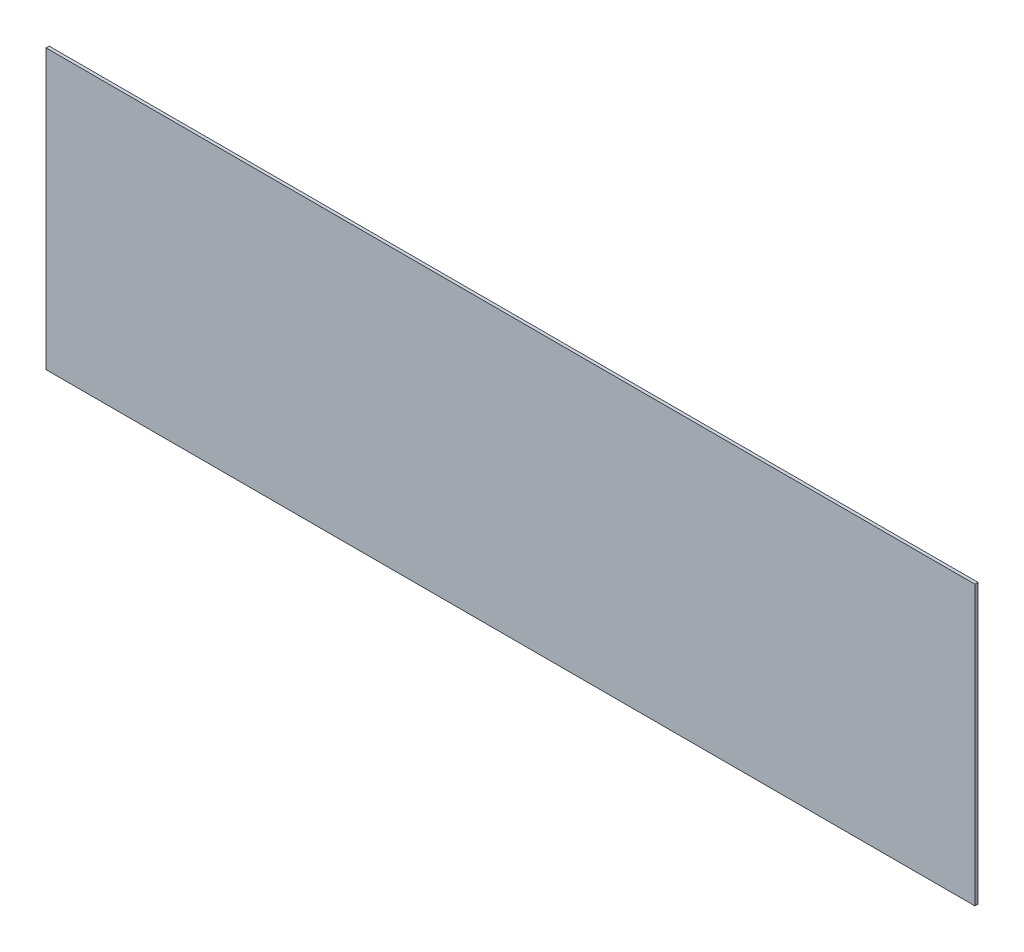
ISO-10303-21;
HEADER;
FILE_DESCRIPTION(('STEP AP214'),'2;1');
FILE_NAME('part.step','',(''),(''),'','','');
FILE_SCHEMA(('AUTOMOTIVE_DESIGN { 1 0 10303 214 1 1 1 1 }'));
ENDSEC;
DATA;
#1=APPLICATION_CONTEXT('core data for automotive mechanical design processes');
#2=APPLICATION_PROTOCOL_DEFINITION('international standard','automotive_design',2000,#1);
#3=PRODUCT_CONTEXT('',#1,'mechanical');
#4=PRODUCT('Part','Part','',(#3));
#5=PRODUCT_RELATED_PRODUCT_CATEGORY('part','',(#4));
#6=PRODUCT_DEFINITION_FORMATION('','',#4);
#7=PRODUCT_DEFINITION_CONTEXT('part definition',#1,'design');
#8=PRODUCT_DEFINITION('design','',#6,#7);
#9=PRODUCT_DEFINITION_SHAPE('','',#8);
#10=(LENGTH_UNIT() NAMED_UNIT(*) SI_UNIT(.MILLI.,.METRE.));
#11=(NAMED_UNIT(*) PLANE_ANGLE_UNIT() SI_UNIT($,.RADIAN.));
#12=(NAMED_UNIT(*) SI_UNIT($,.STERADIAN.) SOLID_ANGLE_UNIT());
#13=UNCERTAINTY_MEASURE_WITH_UNIT(LENGTH_MEASURE(1.E-05),#10,'distance_accuracy_value','');
#14=(GEOMETRIC_REPRESENTATION_CONTEXT(3) GLOBAL_UNCERTAINTY_ASSIGNED_CONTEXT((#13)) GLOBAL_UNIT_ASSIGNED_CONTEXT((#10,
#11,#12)) REPRESENTATION_CONTEXT('',''));
#15=CARTESIAN_POINT('',(0.,0.,0.));
#16=DIRECTION('',(0.,0.,1.));
#17=DIRECTION('',(1.,0.,0.));
#18=AXIS2_PLACEMENT_3D('',#15,#16,#17);
#19=CARTESIAN_POINT('',(50.,130.,-250.));
#20=DIRECTION('',(-1.,0.,0.));
#21=DIRECTION('',(0.,0.,1.));
#22=AXIS2_PLACEMENT_3D('',#19,#20,#21);
#23=PLANE('',#22);
#24=DIRECTION('',(0.,-1.,0.));
#25=VECTOR('',#24,1.);
#26=CARTESIAN_POINT('',(50.,130.,-248.));
#27=LINE('',#26,#25);
#28=CARTESIAN_POINT('',(50.,310.,-248.));
#29=VERTEX_POINT('',#28);
#30=CARTESIAN_POINT('',(50.,130.,-248.));
#31=VERTEX_POINT('',#30);
#32=EDGE_CURVE('E103',#29,#31,#27,.T.);
#33=ORIENTED_EDGE('',*,*,#32,.F.);
#34=DIRECTION('',(0.,0.,1.));
#35=VECTOR('',#34,1.);
#36=CARTESIAN_POINT('',(50.,310.,-250.));
#37=LINE('',#36,#35);
#38=CARTESIAN_POINT('',(50.,310.,-250.));
#39=VERTEX_POINT('',#38);
#40=EDGE_CURVE('E11',#39,#29,#37,.T.);
#41=ORIENTED_EDGE('',*,*,#40,.F.);
#42=DIRECTION('',(0.,-1.,0.));
#43=VECTOR('',#42,1.);
#44=CARTESIAN_POINT('',(50.,130.,-250.));
#45=LINE('',#44,#43);
#46=CARTESIAN_POINT('',(50.,130.,-250.));
#47=VERTEX_POINT('',#46);
#48=EDGE_CURVE('E97',#39,#47,#45,.T.);
#49=ORIENTED_EDGE('',*,*,#48,.T.);
#50=DIRECTION('',(0.,0.,1.));
#51=VECTOR('',#50,1.);
#52=CARTESIAN_POINT('',(50.,130.,-250.));
#53=LINE('',#52,#51);
#54=EDGE_CURVE('E42',#47,#31,#53,.T.);
#55=ORIENTED_EDGE('',*,*,#54,.T.);
#56=EDGE_LOOP('',(#33,#41,#49,#55));
#57=FACE_BOUND('',#56,.T.);
#58=ADVANCED_FACE('F39',(#57),#23,.T.);
#59=CARTESIAN_POINT('',(50.,310.,-250.));
#60=DIRECTION('',(0.,1.,0.));
#61=DIRECTION('',(0.,0.,1.));
#62=AXIS2_PLACEMENT_3D('',#59,#60,#61);
#63=PLANE('',#62);
#64=DIRECTION('',(-1.,0.,0.));
#65=VECTOR('',#64,1.);
#66=CARTESIAN_POINT('',(50.,310.,-248.));
#67=LINE('',#66,#65);
#68=CARTESIAN_POINT('',(650.,310.,-248.));
#69=VERTEX_POINT('',#68);
#70=EDGE_CURVE('E99',#69,#29,#67,.T.);
#71=ORIENTED_EDGE('',*,*,#70,.F.);
#72=DIRECTION('',(0.,0.,1.));
#73=VECTOR('',#72,1.);
#74=CARTESIAN_POINT('',(650.,310.,-250.));
#75=LINE('',#74,#73);
#76=CARTESIAN_POINT('',(650.,310.,-250.));
#77=VERTEX_POINT('',#76);
#78=EDGE_CURVE('E48',#77,#69,#75,.T.);
#79=ORIENTED_EDGE('',*,*,#78,.F.);
#80=DIRECTION('',(-1.,0.,0.));
#81=VECTOR('',#80,1.);
#82=CARTESIAN_POINT('',(50.,310.,-250.));
#83=LINE('',#82,#81);
#84=EDGE_CURVE('E94',#77,#39,#83,.T.);
#85=ORIENTED_EDGE('',*,*,#84,.T.);
#86=ORIENTED_EDGE('',*,*,#40,.T.);
#87=EDGE_LOOP('',(#71,#79,#85,#86));
#88=FACE_BOUND('',#87,.T.);
#89=ADVANCED_FACE('F113',(#88),#63,.T.);
#90=CARTESIAN_POINT('',(650.,130.,-250.));
#91=DIRECTION('',(1.,0.,0.));
#92=DIRECTION('',(0.,0.,-1.));
#93=AXIS2_PLACEMENT_3D('',#90,#91,#92);
#94=PLANE('',#93);
#95=DIRECTION('',(0.,1.,0.));
#96=VECTOR('',#95,1.);
#97=CARTESIAN_POINT('',(650.,130.,-248.));
#98=LINE('',#97,#96);
#99=CARTESIAN_POINT('',(650.,130.,-248.));
#100=VERTEX_POINT('',#99);
#101=EDGE_CURVE('E89',#100,#69,#98,.T.);
#102=ORIENTED_EDGE('',*,*,#101,.F.);
#103=DIRECTION('',(0.,0.,1.));
#104=VECTOR('',#103,1.);
#105=CARTESIAN_POINT('',(650.,130.,-250.));
#106=LINE('',#105,#104);
#107=CARTESIAN_POINT('',(650.,130.,-250.));
#108=VERTEX_POINT('',#107);
#109=EDGE_CURVE('E84',#108,#100,#106,.T.);
#110=ORIENTED_EDGE('',*,*,#109,.F.);
#111=DIRECTION('',(0.,1.,0.));
#112=VECTOR('',#111,1.);
#113=CARTESIAN_POINT('',(650.,130.,-250.));
#114=LINE('',#113,#112);
#115=EDGE_CURVE('E87',#108,#77,#114,.T.);
#116=ORIENTED_EDGE('',*,*,#115,.T.);
#117=ORIENTED_EDGE('',*,*,#78,.T.);
#118=EDGE_LOOP('',(#102,#110,#116,#117));
#119=FACE_BOUND('',#118,.T.);
#120=ADVANCED_FACE('F86',(#119),#94,.T.);
#121=CARTESIAN_POINT('',(50.,130.,-250.));
#122=DIRECTION('',(0.,-1.,0.));
#123=DIRECTION('',(0.,0.,-1.));
#124=AXIS2_PLACEMENT_3D('',#121,#122,#123);
#125=PLANE('',#124);
#126=DIRECTION('',(1.,0.,0.));
#127=VECTOR('',#126,1.);
#128=CARTESIAN_POINT('',(50.,130.,-248.));
#129=LINE('',#128,#127);
#130=EDGE_CURVE('E106',#31,#100,#129,.T.);
#131=ORIENTED_EDGE('',*,*,#130,.F.);
#132=ORIENTED_EDGE('',*,*,#54,.F.);
#133=DIRECTION('',(1.,0.,0.));
#134=VECTOR('',#133,1.);
#135=CARTESIAN_POINT('',(50.,130.,-250.));
#136=LINE('',#135,#134);
#137=EDGE_CURVE('E93',#47,#108,#136,.T.);
#138=ORIENTED_EDGE('',*,*,#137,.T.);
#139=ORIENTED_EDGE('',*,*,#109,.T.);
#140=EDGE_LOOP('',(#131,#132,#138,#139));
#141=FACE_BOUND('',#140,.T.);
#142=ADVANCED_FACE('F96',(#141),#125,.T.);
#143=CARTESIAN_POINT('',(0.,0.,-250.));
#144=DIRECTION('',(0.,0.,-1.));
#145=DIRECTION('',(-1.,0.,0.));
#146=AXIS2_PLACEMENT_3D('',#143,#144,#145);
#147=PLANE('',#146);
#148=ORIENTED_EDGE('',*,*,#48,.F.);
#149=ORIENTED_EDGE('',*,*,#84,.F.);
#150=ORIENTED_EDGE('',*,*,#115,.F.);
#151=ORIENTED_EDGE('',*,*,#137,.F.);
#152=EDGE_LOOP('',(#148,#149,#150,#151));
#153=FACE_BOUND('',#152,.T.);
#154=ADVANCED_FACE('F92',(#153),#147,.T.);
#155=CARTESIAN_POINT('',(0.,0.,-248.));
#156=DIRECTION('',(0.,0.,-1.));
#157=DIRECTION('',(-1.,0.,0.));
#158=AXIS2_PLACEMENT_3D('',#155,#156,#157);
#159=PLANE('',#158);
#160=ORIENTED_EDGE('',*,*,#32,.T.);
#161=ORIENTED_EDGE('',*,*,#130,.T.);
#162=ORIENTED_EDGE('',*,*,#101,.T.);
#163=ORIENTED_EDGE('',*,*,#70,.T.);
#164=EDGE_LOOP('',(#160,#161,#162,#163));
#165=FACE_BOUND('',#164,.T.);
#166=ADVANCED_FACE('F112',(#165),#159,.F.);
#167=CLOSED_SHELL('',(#58,#89,#120,#142,#154,#166));
#168=MANIFOLD_SOLID_BREP('B2',#167);
#169=ADVANCED_BREP_SHAPE_REPRESENTATION('',(#18,#168),#14);
#170=SHAPE_DEFINITION_REPRESENTATION(#9,#169);
ENDSEC;
END-ISO-10303-21;
